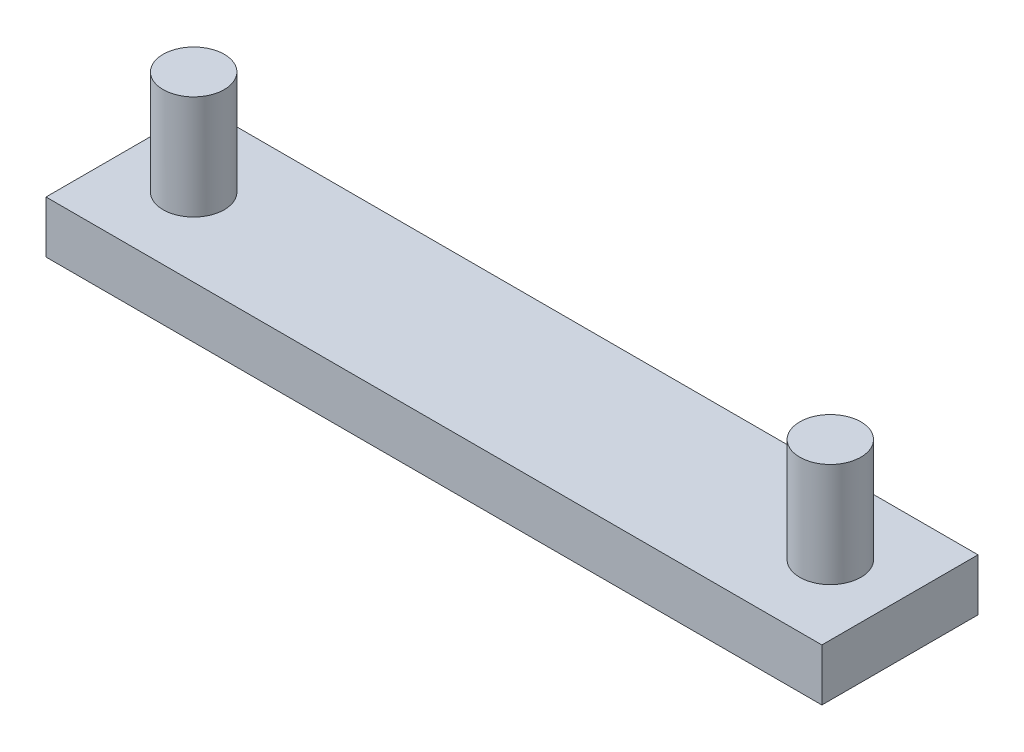
ISO-10303-21;
HEADER;
FILE_DESCRIPTION(('STEP AP214'),'2;1');
FILE_NAME('part.step','',(''),(''),'','','');
FILE_SCHEMA(('AUTOMOTIVE_DESIGN { 1 0 10303 214 1 1 1 1 }'));
ENDSEC;
DATA;
#1=APPLICATION_CONTEXT('core data for automotive mechanical design processes');
#2=APPLICATION_PROTOCOL_DEFINITION('international standard','automotive_design',2000,#1);
#3=PRODUCT_CONTEXT('',#1,'mechanical');
#4=PRODUCT('Part','Part','',(#3));
#5=PRODUCT_RELATED_PRODUCT_CATEGORY('part','',(#4));
#6=PRODUCT_DEFINITION_FORMATION('','',#4);
#7=PRODUCT_DEFINITION_CONTEXT('part definition',#1,'design');
#8=PRODUCT_DEFINITION('design','',#6,#7);
#9=PRODUCT_DEFINITION_SHAPE('','',#8);
#10=(LENGTH_UNIT() NAMED_UNIT(*) SI_UNIT(.MILLI.,.METRE.));
#11=(NAMED_UNIT(*) PLANE_ANGLE_UNIT() SI_UNIT($,.RADIAN.));
#12=(NAMED_UNIT(*) SI_UNIT($,.STERADIAN.) SOLID_ANGLE_UNIT());
#13=UNCERTAINTY_MEASURE_WITH_UNIT(LENGTH_MEASURE(1.E-05),#10,'distance_accuracy_value','');
#14=(GEOMETRIC_REPRESENTATION_CONTEXT(3) GLOBAL_UNCERTAINTY_ASSIGNED_CONTEXT((#13)) GLOBAL_UNIT_ASSIGNED_CONTEXT((#10,
#11,#12)) REPRESENTATION_CONTEXT('',''));
#15=CARTESIAN_POINT('',(0.,0.,0.));
#16=DIRECTION('',(0.,0.,1.));
#17=DIRECTION('',(1.,0.,0.));
#18=AXIS2_PLACEMENT_3D('',#15,#16,#17);
#19=CARTESIAN_POINT('',(0.,50.8,-76.2));
#20=DIRECTION('',(0.,0.,-1.));
#21=DIRECTION('',(-1.,0.,0.));
#22=AXIS2_PLACEMENT_3D('',#19,#20,#21);
#23=PLANE('',#22);
#24=DIRECTION('',(1.,0.,0.));
#25=VECTOR('',#24,1.);
#26=CARTESIAN_POINT('',(0.,0.,-76.2));
#27=LINE('',#26,#25);
#28=CARTESIAN_POINT('',(-689.43,0.,-76.2));
#29=VERTEX_POINT('',#28);
#30=CARTESIAN_POINT('',(67.96,0.,-76.2));
#31=VERTEX_POINT('',#30);
#32=EDGE_CURVE('E106',#29,#31,#27,.T.);
#33=ORIENTED_EDGE('',*,*,#32,.F.);
#34=DIRECTION('',(0.,-1.,0.));
#35=VECTOR('',#34,1.);
#36=CARTESIAN_POINT('',(-689.43,50.8,-76.2));
#37=LINE('',#36,#35);
#38=CARTESIAN_POINT('',(-689.43,50.8,-76.2));
#39=VERTEX_POINT('',#38);
#40=EDGE_CURVE('E11',#39,#29,#37,.T.);
#41=ORIENTED_EDGE('',*,*,#40,.F.);
#42=DIRECTION('',(1.,0.,0.));
#43=VECTOR('',#42,1.);
#44=CARTESIAN_POINT('',(0.,50.8,-76.2));
#45=LINE('',#44,#43);
#46=CARTESIAN_POINT('',(67.96,50.8,-76.2));
#47=VERTEX_POINT('',#46);
#48=EDGE_CURVE('E85',#39,#47,#45,.T.);
#49=ORIENTED_EDGE('',*,*,#48,.T.);
#50=DIRECTION('',(0.,-1.,0.));
#51=VECTOR('',#50,1.);
#52=CARTESIAN_POINT('',(67.96,50.8,-76.2));
#53=LINE('',#52,#51);
#54=EDGE_CURVE('E52',#47,#31,#53,.T.);
#55=ORIENTED_EDGE('',*,*,#54,.T.);
#56=EDGE_LOOP('',(#33,#41,#49,#55));
#57=FACE_BOUND('',#56,.T.);
#58=ADVANCED_FACE('F36',(#57),#23,.T.);
#59=CARTESIAN_POINT('',(-689.43,50.8,0.));
#60=DIRECTION('',(1.,0.,0.));
#61=DIRECTION('',(0.,0.,-1.));
#62=AXIS2_PLACEMENT_3D('',#59,#60,#61);
#63=PLANE('',#62);
#64=DIRECTION('',(0.,0.,1.));
#65=VECTOR('',#64,1.);
#66=CARTESIAN_POINT('',(-689.43,0.,0.));
#67=LINE('',#66,#65);
#68=CARTESIAN_POINT('',(-689.43,0.,76.2));
#69=VERTEX_POINT('',#68);
#70=EDGE_CURVE('E91',#29,#69,#67,.T.);
#71=ORIENTED_EDGE('',*,*,#70,.T.);
#72=DIRECTION('',(0.,-1.,0.));
#73=VECTOR('',#72,1.);
#74=CARTESIAN_POINT('',(-689.43,50.8,76.2));
#75=LINE('',#74,#73);
#76=CARTESIAN_POINT('',(-689.43,50.8,76.2));
#77=VERTEX_POINT('',#76);
#78=EDGE_CURVE('E44',#77,#69,#75,.T.);
#79=ORIENTED_EDGE('',*,*,#78,.F.);
#80=DIRECTION('',(0.,0.,1.));
#81=VECTOR('',#80,1.);
#82=CARTESIAN_POINT('',(-689.43,50.8,0.));
#83=LINE('',#82,#81);
#84=EDGE_CURVE('E78',#39,#77,#83,.T.);
#85=ORIENTED_EDGE('',*,*,#84,.F.);
#86=ORIENTED_EDGE('',*,*,#40,.T.);
#87=EDGE_LOOP('',(#71,#79,#85,#86));
#88=FACE_BOUND('',#87,.T.);
#89=ADVANCED_FACE('F89',(#88),#63,.F.);
#90=CARTESIAN_POINT('',(0.,50.8,76.2));
#91=DIRECTION('',(0.,0.,-1.));
#92=DIRECTION('',(-1.,0.,0.));
#93=AXIS2_PLACEMENT_3D('',#90,#91,#92);
#94=PLANE('',#93);
#95=DIRECTION('',(1.,0.,0.));
#96=VECTOR('',#95,1.);
#97=CARTESIAN_POINT('',(0.,0.,76.2));
#98=LINE('',#97,#96);
#99=CARTESIAN_POINT('',(67.96,0.,76.2));
#100=VERTEX_POINT('',#99);
#101=EDGE_CURVE('E110',#69,#100,#98,.T.);
#102=ORIENTED_EDGE('',*,*,#101,.T.);
#103=DIRECTION('',(0.,-1.,0.));
#104=VECTOR('',#103,1.);
#105=CARTESIAN_POINT('',(67.96,50.8,76.2));
#106=LINE('',#105,#104);
#107=CARTESIAN_POINT('',(67.96,50.8,76.2));
#108=VERTEX_POINT('',#107);
#109=EDGE_CURVE('E66',#108,#100,#106,.T.);
#110=ORIENTED_EDGE('',*,*,#109,.F.);
#111=DIRECTION('',(1.,0.,0.));
#112=VECTOR('',#111,1.);
#113=CARTESIAN_POINT('',(0.,50.8,76.2));
#114=LINE('',#113,#112);
#115=EDGE_CURVE('E84',#77,#108,#114,.T.);
#116=ORIENTED_EDGE('',*,*,#115,.F.);
#117=ORIENTED_EDGE('',*,*,#78,.T.);
#118=EDGE_LOOP('',(#102,#110,#116,#117));
#119=FACE_BOUND('',#118,.T.);
#120=ADVANCED_FACE('F94',(#119),#94,.F.);
#121=CARTESIAN_POINT('',(67.96,50.8,0.));
#122=DIRECTION('',(1.,0.,0.));
#123=DIRECTION('',(0.,0.,-1.));
#124=AXIS2_PLACEMENT_3D('',#121,#122,#123);
#125=PLANE('',#124);
#126=DIRECTION('',(0.,0.,1.));
#127=VECTOR('',#126,1.);
#128=CARTESIAN_POINT('',(67.96,0.,0.));
#129=LINE('',#128,#127);
#130=EDGE_CURVE('E112',#31,#100,#129,.T.);
#131=ORIENTED_EDGE('',*,*,#130,.F.);
#132=ORIENTED_EDGE('',*,*,#54,.F.);
#133=DIRECTION('',(0.,0.,1.));
#134=VECTOR('',#133,1.);
#135=CARTESIAN_POINT('',(67.96,50.8,0.));
#136=LINE('',#135,#134);
#137=EDGE_CURVE('E95',#47,#108,#136,.T.);
#138=ORIENTED_EDGE('',*,*,#137,.T.);
#139=ORIENTED_EDGE('',*,*,#109,.T.);
#140=EDGE_LOOP('',(#131,#132,#138,#139));
#141=FACE_BOUND('',#140,.T.);
#142=ADVANCED_FACE('F140',(#141),#125,.T.);
#143=CARTESIAN_POINT('',(0.,50.8,0.));
#144=DIRECTION('',(0.,1.,0.));
#145=DIRECTION('',(0.,0.,1.));
#146=AXIS2_PLACEMENT_3D('',#143,#144,#145);
#147=PLANE('',#146);
#148=ORIENTED_EDGE('',*,*,#48,.F.);
#149=ORIENTED_EDGE('',*,*,#84,.T.);
#150=ORIENTED_EDGE('',*,*,#115,.T.);
#151=ORIENTED_EDGE('',*,*,#137,.F.);
#152=EDGE_LOOP('',(#148,#149,#150,#151));
#153=FACE_BOUND('',#152,.T.);
#154=CARTESIAN_POINT('',(-621.47,50.8,0.));
#155=DIRECTION('',(0.,1.,0.));
#156=DIRECTION('',(0.,0.,1.));
#157=AXIS2_PLACEMENT_3D('',#154,#155,#156);
#158=CIRCLE('',#157,29.86);
#159=CARTESIAN_POINT('',(-621.47,50.8,29.86));
#160=VERTEX_POINT('',#159);
#161=EDGE_CURVE('E97',#160,#160,#158,.T.);
#162=ORIENTED_EDGE('',*,*,#161,.F.);
#163=EDGE_LOOP('',(#162));
#164=FACE_BOUND('',#163,.T.);
#165=CARTESIAN_POINT('',(0.,50.8,0.));
#166=DIRECTION('',(0.,1.,0.));
#167=DIRECTION('',(0.,0.,1.));
#168=AXIS2_PLACEMENT_3D('',#165,#166,#167);
#169=CIRCLE('',#168,29.86);
#170=CARTESIAN_POINT('',(0.,50.8,29.86));
#171=VERTEX_POINT('',#170);
#172=EDGE_CURVE('E103',#171,#171,#169,.T.);
#173=ORIENTED_EDGE('',*,*,#172,.F.);
#174=EDGE_LOOP('',(#173));
#175=FACE_BOUND('',#174,.T.);
#176=ADVANCED_FACE('F80',(#153,#164,#175),#147,.T.);
#177=CARTESIAN_POINT('',(0.,0.,0.));
#178=DIRECTION('',(0.,1.,0.));
#179=DIRECTION('',(0.,0.,1.));
#180=AXIS2_PLACEMENT_3D('',#177,#178,#179);
#181=PLANE('',#180);
#182=ORIENTED_EDGE('',*,*,#32,.T.);
#183=ORIENTED_EDGE('',*,*,#130,.T.);
#184=ORIENTED_EDGE('',*,*,#101,.F.);
#185=ORIENTED_EDGE('',*,*,#70,.F.);
#186=EDGE_LOOP('',(#182,#183,#184,#185));
#187=FACE_BOUND('',#186,.T.);
#188=ADVANCED_FACE('F139',(#187),#181,.F.);
#189=CARTESIAN_POINT('',(0.,152.4,0.));
#190=DIRECTION('',(0.,-1.,0.));
#191=DIRECTION('',(0.,0.,-1.));
#192=AXIS2_PLACEMENT_3D('',#189,#190,#191);
#193=CYLINDRICAL_SURFACE('',#192,29.86);
#194=ORIENTED_EDGE('',*,*,#172,.T.);
#195=EDGE_LOOP('',(#194));
#196=FACE_BOUND('',#195,.T.);
#197=CARTESIAN_POINT('',(0.,152.4,0.));
#198=DIRECTION('',(0.,-1.,0.));
#199=DIRECTION('',(0.,0.,-1.));
#200=AXIS2_PLACEMENT_3D('',#197,#198,#199);
#201=CIRCLE('',#200,29.86);
#202=CARTESIAN_POINT('',(0.,152.4,-29.86));
#203=VERTEX_POINT('',#202);
#204=EDGE_CURVE('E108',#203,#203,#201,.T.);
#205=ORIENTED_EDGE('',*,*,#204,.T.);
#206=EDGE_LOOP('',(#205));
#207=FACE_BOUND('',#206,.T.);
#208=ADVANCED_FACE('F151',(#196,#207),#193,.T.);
#209=CARTESIAN_POINT('',(0.,152.4,0.));
#210=DIRECTION('',(0.,-1.,0.));
#211=DIRECTION('',(0.,0.,-1.));
#212=AXIS2_PLACEMENT_3D('',#209,#210,#211);
#213=PLANE('',#212);
#214=ORIENTED_EDGE('',*,*,#204,.F.);
#215=EDGE_LOOP('',(#214));
#216=FACE_BOUND('',#215,.T.);
#217=ADVANCED_FACE('F132',(#216),#213,.F.);
#218=CARTESIAN_POINT('',(-621.47,152.4,0.));
#219=DIRECTION('',(0.,-1.,0.));
#220=DIRECTION('',(0.,0.,-1.));
#221=AXIS2_PLACEMENT_3D('',#218,#219,#220);
#222=CYLINDRICAL_SURFACE('',#221,29.86);
#223=ORIENTED_EDGE('',*,*,#161,.T.);
#224=EDGE_LOOP('',(#223));
#225=FACE_BOUND('',#224,.T.);
#226=CARTESIAN_POINT('',(-621.47,152.4,0.));
#227=DIRECTION('',(0.,-1.,0.));
#228=DIRECTION('',(0.,0.,-1.));
#229=AXIS2_PLACEMENT_3D('',#226,#227,#228);
#230=CIRCLE('',#229,29.86);
#231=CARTESIAN_POINT('',(-621.47,152.4,-29.86));
#232=VERTEX_POINT('',#231);
#233=EDGE_CURVE('E120',#232,#232,#230,.T.);
#234=ORIENTED_EDGE('',*,*,#233,.T.);
#235=EDGE_LOOP('',(#234));
#236=FACE_BOUND('',#235,.T.);
#237=ADVANCED_FACE('F124',(#225,#236),#222,.T.);
#238=CARTESIAN_POINT('',(-621.47,152.4,0.));
#239=DIRECTION('',(0.,-1.,0.));
#240=DIRECTION('',(0.,0.,-1.));
#241=AXIS2_PLACEMENT_3D('',#238,#239,#240);
#242=PLANE('',#241);
#243=ORIENTED_EDGE('',*,*,#233,.F.);
#244=EDGE_LOOP('',(#243));
#245=FACE_BOUND('',#244,.T.);
#246=ADVANCED_FACE('F126',(#245),#242,.F.);
#247=CLOSED_SHELL('',(#58,#89,#120,#142,#176,#188,#208,#217,#237,#246));
#248=MANIFOLD_SOLID_BREP('B2',#247);
#249=ADVANCED_BREP_SHAPE_REPRESENTATION('',(#18,#248),#14);
#250=SHAPE_DEFINITION_REPRESENTATION(#9,#249);
ENDSEC;
END-ISO-10303-21;
